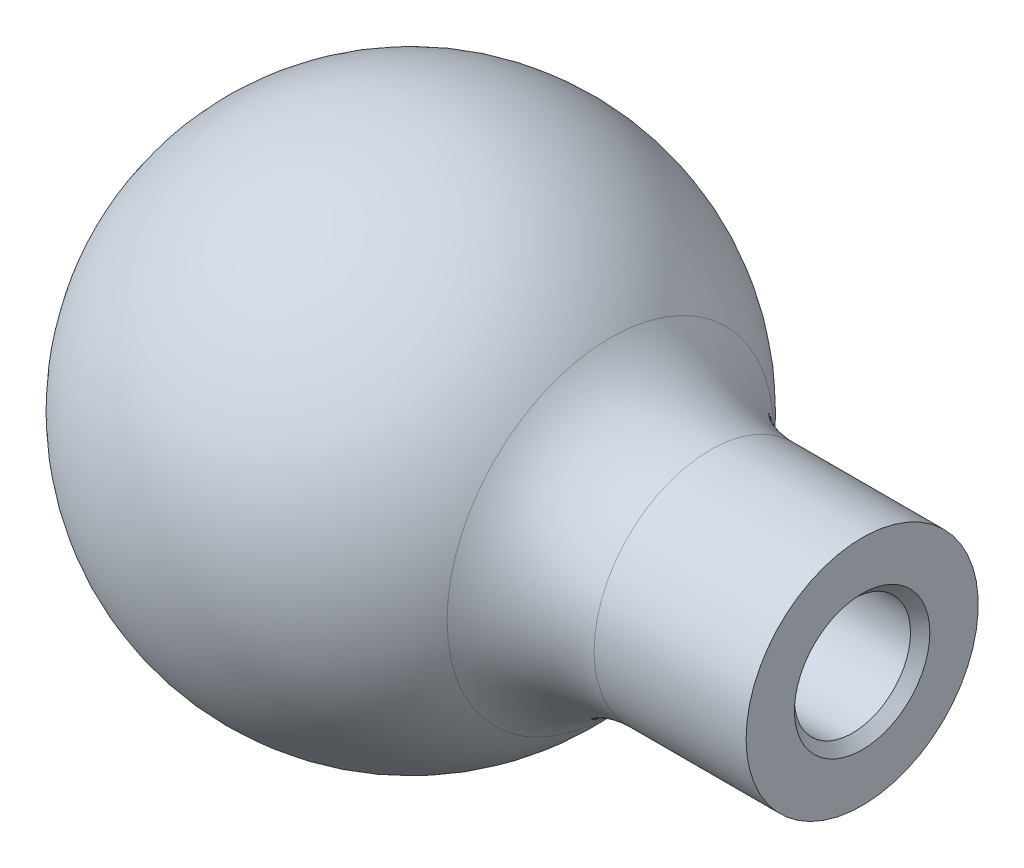
ISO-10303-21;
HEADER;
FILE_DESCRIPTION(('STEP AP214'),'2;1');
FILE_NAME('part.step','',(''),(''),'','','');
FILE_SCHEMA(('AUTOMOTIVE_DESIGN { 1 0 10303 214 1 1 1 1 }'));
ENDSEC;
DATA;
#1=APPLICATION_CONTEXT('core data for automotive mechanical design processes');
#2=APPLICATION_PROTOCOL_DEFINITION('international standard','automotive_design',2000,#1);
#3=PRODUCT_CONTEXT('',#1,'mechanical');
#4=PRODUCT('Part','Part','',(#3));
#5=PRODUCT_RELATED_PRODUCT_CATEGORY('part','',(#4));
#6=PRODUCT_DEFINITION_FORMATION('','',#4);
#7=PRODUCT_DEFINITION_CONTEXT('part definition',#1,'design');
#8=PRODUCT_DEFINITION('design','',#6,#7);
#9=PRODUCT_DEFINITION_SHAPE('','',#8);
#10=(LENGTH_UNIT() NAMED_UNIT(*) SI_UNIT(.MILLI.,.METRE.));
#11=(NAMED_UNIT(*) PLANE_ANGLE_UNIT() SI_UNIT($,.RADIAN.));
#12=(NAMED_UNIT(*) SI_UNIT($,.STERADIAN.) SOLID_ANGLE_UNIT());
#13=UNCERTAINTY_MEASURE_WITH_UNIT(LENGTH_MEASURE(1.E-05),#10,'distance_accuracy_value','');
#14=(GEOMETRIC_REPRESENTATION_CONTEXT(3) GLOBAL_UNCERTAINTY_ASSIGNED_CONTEXT((#13)) GLOBAL_UNIT_ASSIGNED_CONTEXT((#10,
#11,#12)) REPRESENTATION_CONTEXT('',''));
#15=CARTESIAN_POINT('',(0.,0.,0.));
#16=DIRECTION('',(0.,0.,1.));
#17=DIRECTION('',(1.,0.,0.));
#18=AXIS2_PLACEMENT_3D('',#15,#16,#17);
#19=CARTESIAN_POINT('',(0.,0.,0.));
#20=DIRECTION('',(-1.,0.,0.));
#21=DIRECTION('',(0.,1.,0.));
#22=AXIS2_PLACEMENT_3D('',#19,#20,#21);
#23=SPHERICAL_SURFACE('',#22,20.);
#24=CARTESIAN_POINT('',(15.4775823549919,0.,0.));
#25=DIRECTION('',(-1.,0.,0.));
#26=DIRECTION('',(0.,0.,1.));
#27=AXIS2_PLACEMENT_3D('',#24,#25,#26);
#28=CIRCLE('',#27,12.6666666666667);
#29=CARTESIAN_POINT('',(15.4775823549919,0.,12.6666666666667));
#30=VERTEX_POINT('',#29);
#31=EDGE_CURVE('E49',#30,#30,#28,.T.);
#32=ORIENTED_EDGE('',*,*,#31,.T.);
#33=EDGE_LOOP('',(#32));
#34=FACE_BOUND('',#33,.T.);
#35=ADVANCED_FACE('F42',(#34),#23,.T.);
#36=CARTESIAN_POINT('',(35.,0.,0.));
#37=DIRECTION('',(-1.,0.,0.));
#38=DIRECTION('',(0.,0.,1.));
#39=AXIS2_PLACEMENT_3D('',#36,#37,#38);
#40=PLANE('',#39);
#41=CARTESIAN_POINT('',(35.,0.,0.));
#42=DIRECTION('',(1.,0.,0.));
#43=DIRECTION('',(0.,0.,-1.));
#44=AXIS2_PLACEMENT_3D('',#41,#42,#43);
#45=CIRCLE('',#44,5.25);
#46=CARTESIAN_POINT('',(35.,0.,-5.25));
#47=VERTEX_POINT('',#46);
#48=EDGE_CURVE('E67',#47,#47,#45,.T.);
#49=ORIENTED_EDGE('',*,*,#48,.F.);
#50=EDGE_LOOP('',(#49));
#51=FACE_BOUND('',#50,.T.);
#52=CARTESIAN_POINT('',(35.,0.,0.));
#53=DIRECTION('',(-1.,0.,0.));
#54=DIRECTION('',(0.,0.,1.));
#55=AXIS2_PLACEMENT_3D('',#52,#53,#54);
#56=CIRCLE('',#55,9.00000000000001);
#57=CARTESIAN_POINT('',(35.,0.,9.00000000000001));
#58=VERTEX_POINT('',#57);
#59=EDGE_CURVE('E61',#58,#58,#56,.T.);
#60=ORIENTED_EDGE('',*,*,#59,.F.);
#61=EDGE_LOOP('',(#60));
#62=FACE_BOUND('',#61,.T.);
#63=ADVANCED_FACE('F80',(#51,#62),#40,.F.);
#64=CARTESIAN_POINT('',(0.,0.,0.));
#65=DIRECTION('',(-1.,0.,0.));
#66=DIRECTION('',(0.,0.,1.));
#67=AXIS2_PLACEMENT_3D('',#64,#65,#66);
#68=CYLINDRICAL_SURFACE('',#67,9.00000000000001);
#69=CARTESIAN_POINT('',(23.2163735324878,0.,0.));
#70=DIRECTION('',(-1.,0.,0.));
#71=DIRECTION('',(0.,0.,1.));
#72=AXIS2_PLACEMENT_3D('',#69,#70,#71);
#73=CIRCLE('',#72,9.00000000000001);
#74=CARTESIAN_POINT('',(23.2163735324878,0.,9.00000000000001));
#75=VERTEX_POINT('',#74);
#76=EDGE_CURVE('E11',#75,#75,#73,.F.);
#77=ORIENTED_EDGE('',*,*,#76,.T.);
#78=EDGE_LOOP('',(#77));
#79=FACE_BOUND('',#78,.T.);
#80=ORIENTED_EDGE('',*,*,#59,.T.);
#81=EDGE_LOOP('',(#80));
#82=FACE_BOUND('',#81,.T.);
#83=ADVANCED_FACE('F75',(#79,#82),#68,.T.);
#84=CARTESIAN_POINT('',(23.2163735324878,0.,0.));
#85=DIRECTION('',(-1.,0.,0.));
#86=DIRECTION('',(0.,0.,1.));
#87=AXIS2_PLACEMENT_3D('',#84,#85,#86);
#88=TOROIDAL_SURFACE('',#87,19.,10.);
#89=ORIENTED_EDGE('',*,*,#76,.F.);
#90=EDGE_LOOP('',(#89));
#91=FACE_BOUND('',#90,.T.);
#92=ORIENTED_EDGE('',*,*,#31,.F.);
#93=EDGE_LOOP('',(#92));
#94=FACE_BOUND('',#93,.T.);
#95=ADVANCED_FACE('F44',(#91,#94),#88,.F.);
#96=CARTESIAN_POINT('',(10.,0.,0.));
#97=DIRECTION('',(1.,0.,0.));
#98=DIRECTION('',(0.,0.,-1.));
#99=AXIS2_PLACEMENT_3D('',#96,#97,#98);
#100=CONICAL_SURFACE('',#99,4.49999999999999,1.02974425867665);
#101=CARTESIAN_POINT('',(7.29612721437598,0.,0.));
#102=VERTEX_POINT('',#101);
#103=VERTEX_LOOP('',#102);
#104=FACE_BOUND('',#103,.T.);
#105=CARTESIAN_POINT('',(10.,0.,0.));
#106=DIRECTION('',(1.,0.,0.));
#107=DIRECTION('',(0.,0.,-1.));
#108=AXIS2_PLACEMENT_3D('',#105,#106,#107);
#109=CIRCLE('',#108,4.49999999999999);
#110=CARTESIAN_POINT('',(10.,0.,-4.49999999999999));
#111=VERTEX_POINT('',#110);
#112=EDGE_CURVE('E59',#111,#111,#109,.T.);
#113=ORIENTED_EDGE('',*,*,#112,.T.);
#114=EDGE_LOOP('',(#113));
#115=FACE_BOUND('',#114,.T.);
#116=ADVANCED_FACE('F52',(#104,#115),#100,.F.);
#117=CARTESIAN_POINT('',(35.,0.,0.));
#118=DIRECTION('',(1.,0.,0.));
#119=DIRECTION('',(0.,0.,-1.));
#120=AXIS2_PLACEMENT_3D('',#117,#118,#119);
#121=CYLINDRICAL_SURFACE('',#120,4.5);
#122=ORIENTED_EDGE('',*,*,#112,.F.);
#123=EDGE_LOOP('',(#122));
#124=FACE_BOUND('',#123,.T.);
#125=CARTESIAN_POINT('',(34.25,0.,0.));
#126=DIRECTION('',(1.,0.,0.));
#127=DIRECTION('',(0.,0.,-1.));
#128=AXIS2_PLACEMENT_3D('',#125,#126,#127);
#129=CIRCLE('',#128,4.5);
#130=CARTESIAN_POINT('',(34.25,0.,-4.5));
#131=VERTEX_POINT('',#130);
#132=EDGE_CURVE('E62',#131,#131,#129,.T.);
#133=ORIENTED_EDGE('',*,*,#132,.T.);
#134=EDGE_LOOP('',(#133));
#135=FACE_BOUND('',#134,.T.);
#136=ADVANCED_FACE('F55',(#124,#135),#121,.F.);
#137=CARTESIAN_POINT('',(35.,0.,0.));
#138=DIRECTION('',(1.,0.,0.));
#139=DIRECTION('',(0.,0.,-1.));
#140=AXIS2_PLACEMENT_3D('',#137,#138,#139);
#141=CONICAL_SURFACE('',#140,5.25,0.78539816339745);
#142=ORIENTED_EDGE('',*,*,#132,.F.);
#143=EDGE_LOOP('',(#142));
#144=FACE_BOUND('',#143,.T.);
#145=ORIENTED_EDGE('',*,*,#48,.T.);
#146=EDGE_LOOP('',(#145));
#147=FACE_BOUND('',#146,.T.);
#148=ADVANCED_FACE('F93',(#144,#147),#141,.F.);
#149=CLOSED_SHELL('',(#35,#63,#83,#95,#116,#136,#148));
#150=MANIFOLD_SOLID_BREP('B2',#149);
#151=ADVANCED_BREP_SHAPE_REPRESENTATION('',(#18,#150),#14);
#152=SHAPE_DEFINITION_REPRESENTATION(#9,#151);
ENDSEC;
END-ISO-10303-21;
